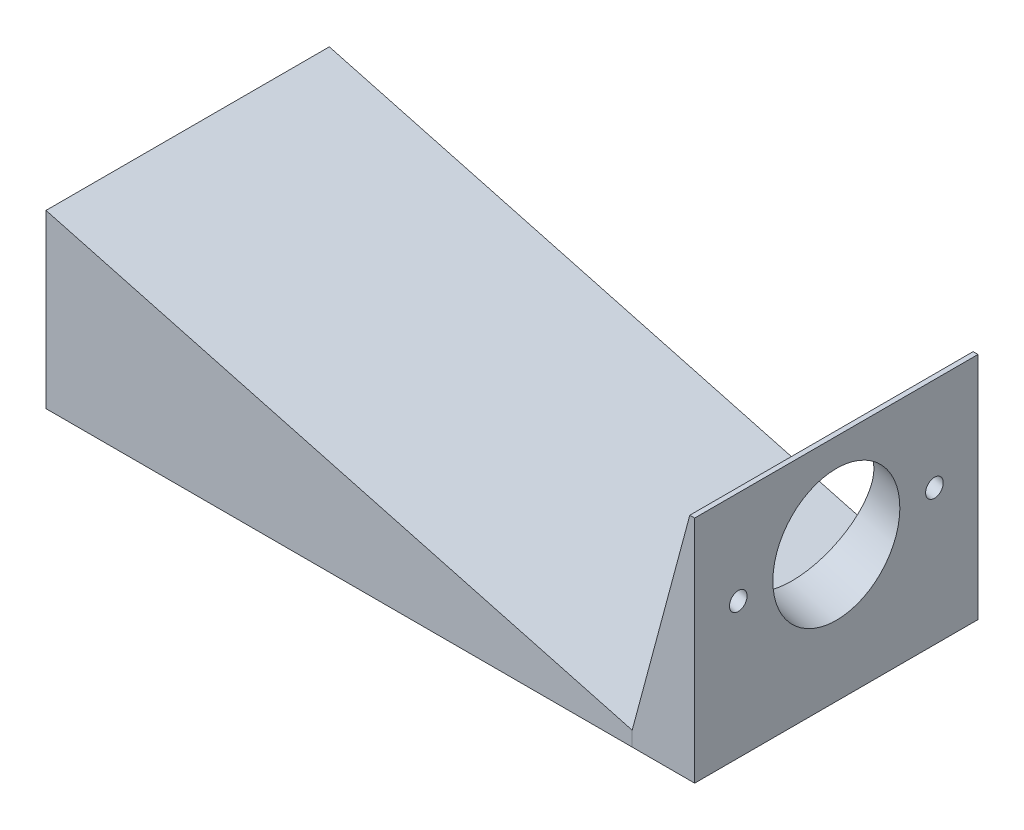
ISO-10303-21;
HEADER;
FILE_DESCRIPTION(('STEP AP214'),'2;1');
FILE_NAME('part.step','',(''),(''),'','','');
FILE_SCHEMA(('AUTOMOTIVE_DESIGN { 1 0 10303 214 1 1 1 1 }'));
ENDSEC;
DATA;
#1=APPLICATION_CONTEXT('core data for automotive mechanical design processes');
#2=APPLICATION_PROTOCOL_DEFINITION('international standard','automotive_design',2000,#1);
#3=PRODUCT_CONTEXT('',#1,'mechanical');
#4=PRODUCT('Part','Part','',(#3));
#5=PRODUCT_RELATED_PRODUCT_CATEGORY('part','',(#4));
#6=PRODUCT_DEFINITION_FORMATION('','',#4);
#7=PRODUCT_DEFINITION_CONTEXT('part definition',#1,'design');
#8=PRODUCT_DEFINITION('design','',#6,#7);
#9=PRODUCT_DEFINITION_SHAPE('','',#8);
#10=(LENGTH_UNIT() NAMED_UNIT(*) SI_UNIT(.MILLI.,.METRE.));
#11=(NAMED_UNIT(*) PLANE_ANGLE_UNIT() SI_UNIT($,.RADIAN.));
#12=(NAMED_UNIT(*) SI_UNIT($,.STERADIAN.) SOLID_ANGLE_UNIT());
#13=UNCERTAINTY_MEASURE_WITH_UNIT(LENGTH_MEASURE(1.E-05),#10,'distance_accuracy_value','');
#14=(GEOMETRIC_REPRESENTATION_CONTEXT(3) GLOBAL_UNCERTAINTY_ASSIGNED_CONTEXT((#13)) GLOBAL_UNIT_ASSIGNED_CONTEXT((#10,
#11,#12)) REPRESENTATION_CONTEXT('',''));
#15=CARTESIAN_POINT('',(0.,0.,0.));
#16=DIRECTION('',(0.,0.,1.));
#17=DIRECTION('',(1.,0.,0.));
#18=AXIS2_PLACEMENT_3D('',#15,#16,#17);
#19=CARTESIAN_POINT('',(36.3961711200607,0.,-29.));
#20=DIRECTION('',(0.,-1.,0.));
#21=DIRECTION('',(1.,0.,0.));
#22=AXIS2_PLACEMENT_3D('',#19,#20,#21);
#23=PLANE('',#22);
#24=DIRECTION('',(1.,0.,0.));
#25=VECTOR('',#24,1.);
#26=CARTESIAN_POINT('',(36.3961711200607,0.,0.));
#27=LINE('',#26,#25);
#28=CARTESIAN_POINT('',(30.,0.,0.));
#29=VERTEX_POINT('',#28);
#30=CARTESIAN_POINT('',(36.3961711200607,0.,0.));
#31=VERTEX_POINT('',#30);
#32=EDGE_CURVE('E127',#29,#31,#27,.T.);
#33=ORIENTED_EDGE('',*,*,#32,.F.);
#34=DIRECTION('',(0.,0.,1.));
#35=VECTOR('',#34,1.);
#36=CARTESIAN_POINT('',(30.,0.,-29.));
#37=LINE('',#36,#35);
#38=CARTESIAN_POINT('',(30.,0.,-29.));
#39=VERTEX_POINT('',#38);
#40=EDGE_CURVE('E12',#39,#29,#37,.T.);
#41=ORIENTED_EDGE('',*,*,#40,.F.);
#42=DIRECTION('',(1.,0.,0.));
#43=VECTOR('',#42,1.);
#44=CARTESIAN_POINT('',(36.3961711200607,0.,-29.));
#45=LINE('',#44,#43);
#46=CARTESIAN_POINT('',(36.3961711200607,0.,-29.));
#47=VERTEX_POINT('',#46);
#48=EDGE_CURVE('E122',#39,#47,#45,.T.);
#49=ORIENTED_EDGE('',*,*,#48,.T.);
#50=DIRECTION('',(0.,0.,1.));
#51=VECTOR('',#50,1.);
#52=CARTESIAN_POINT('',(36.3961711200607,0.,-29.));
#53=LINE('',#52,#51);
#54=EDGE_CURVE('E96',#47,#31,#53,.T.);
#55=ORIENTED_EDGE('',*,*,#54,.T.);
#56=EDGE_LOOP('',(#33,#41,#49,#55));
#57=FACE_BOUND('',#56,.T.);
#58=ADVANCED_FACE('F49',(#57),#23,.T.);
#59=CARTESIAN_POINT('',(30.,0.,-29.));
#60=DIRECTION('',(-1.,0.,0.));
#61=DIRECTION('',(0.,0.,1.));
#62=AXIS2_PLACEMENT_3D('',#59,#60,#61);
#63=PLANE('',#62);
#64=DIRECTION('',(0.,-1.,0.));
#65=VECTOR('',#64,1.);
#66=CARTESIAN_POINT('',(30.,0.,0.));
#67=LINE('',#66,#65);
#68=CARTESIAN_POINT('',(30.,1.50000000000001,0.));
#69=VERTEX_POINT('',#68);
#70=EDGE_CURVE('E137',#69,#29,#67,.T.);
#71=ORIENTED_EDGE('',*,*,#70,.F.);
#72=DIRECTION('',(0.,0.,1.));
#73=VECTOR('',#72,1.);
#74=CARTESIAN_POINT('',(30.,1.50000000000001,-29.));
#75=LINE('',#74,#73);
#76=CARTESIAN_POINT('',(30.,1.50000000000001,-29.));
#77=VERTEX_POINT('',#76);
#78=EDGE_CURVE('E58',#77,#69,#75,.T.);
#79=ORIENTED_EDGE('',*,*,#78,.F.);
#80=DIRECTION('',(0.,-1.,0.));
#81=VECTOR('',#80,1.);
#82=CARTESIAN_POINT('',(30.,0.,-29.));
#83=LINE('',#82,#81);
#84=EDGE_CURVE('E117',#77,#39,#83,.T.);
#85=ORIENTED_EDGE('',*,*,#84,.T.);
#86=ORIENTED_EDGE('',*,*,#40,.T.);
#87=EDGE_LOOP('',(#71,#79,#85,#86));
#88=FACE_BOUND('',#87,.T.);
#89=ADVANCED_FACE('F160',(#88),#63,.T.);
#90=CARTESIAN_POINT('',(30.,1.50000000000001,-29.));
#91=DIRECTION('',(-0.965925826289069,0.258819045102518,0.));
#92=DIRECTION('',(-0.258819045102518,-0.965925826289069,0.));
#93=AXIS2_PLACEMENT_3D('',#90,#91,#92);
#94=PLANE('',#93);
#95=CARTESIAN_POINT('',(33.5328799656494,14.6848875288458,-24.54));
#96=DIRECTION('',(-0.965925826289069,0.258819045102518,0.));
#97=DIRECTION('',(-0.258819045102518,-0.965925826289069,0.));
#98=AXIS2_PLACEMENT_3D('',#95,#96,#97);
#99=CIRCLE('',#98,0.900000000000001);
#100=CARTESIAN_POINT('',(33.2999428250571,13.8155542851856,-24.54));
#101=VERTEX_POINT('',#100);
#102=EDGE_CURVE('E147',#101,#101,#99,.T.);
#103=ORIENTED_EDGE('',*,*,#102,.F.);
#104=EDGE_LOOP('',(#103));
#105=FACE_BOUND('',#104,.T.);
#106=CARTESIAN_POINT('',(33.5328799656494,14.6848875288458,-4.46));
#107=DIRECTION('',(-0.965925826289069,0.258819045102518,0.));
#108=DIRECTION('',(0.258819045102518,0.965925826289069,0.));
#109=AXIS2_PLACEMENT_3D('',#106,#107,#108);
#110=CIRCLE('',#109,0.9);
#111=CARTESIAN_POINT('',(33.7658171062416,15.554220772506,-4.46));
#112=VERTEX_POINT('',#111);
#113=EDGE_CURVE('E152',#112,#112,#110,.T.);
#114=ORIENTED_EDGE('',*,*,#113,.F.);
#115=EDGE_LOOP('',(#114));
#116=FACE_BOUND('',#115,.T.);
#117=CARTESIAN_POINT('',(33.5328799656494,14.6848875288458,-14.5));
#118=DIRECTION('',(-0.965925826289069,0.258819045102518,0.));
#119=DIRECTION('',(-0.258819045102518,-0.965925826289069,0.));
#120=AXIS2_PLACEMENT_3D('',#117,#118,#119);
#121=CIRCLE('',#120,6.5);
#122=CARTESIAN_POINT('',(31.850556172483,8.40636965796685,-14.5));
#123=VERTEX_POINT('',#122);
#124=EDGE_CURVE('E144',#123,#123,#121,.T.);
#125=ORIENTED_EDGE('',*,*,#124,.F.);
#126=EDGE_LOOP('',(#125));
#127=FACE_BOUND('',#126,.T.);
#128=DIRECTION('',(-0.258819045102518,-0.965925826289069,0.));
#129=VECTOR('',#128,1.);
#130=CARTESIAN_POINT('',(30.,1.50000000000001,0.));
#131=LINE('',#130,#129);
#132=CARTESIAN_POINT('',(35.8961711200607,23.5048101901873,0.));
#133=VERTEX_POINT('',#132);
#134=EDGE_CURVE('E106',#133,#69,#131,.T.);
#135=ORIENTED_EDGE('',*,*,#134,.F.);
#136=DIRECTION('',(0.,0.,1.));
#137=VECTOR('',#136,1.);
#138=CARTESIAN_POINT('',(35.8961711200607,23.5048101901873,-29.));
#139=LINE('',#138,#137);
#140=CARTESIAN_POINT('',(35.8961711200607,23.5048101901873,-29.));
#141=VERTEX_POINT('',#140);
#142=EDGE_CURVE('E101',#141,#133,#139,.T.);
#143=ORIENTED_EDGE('',*,*,#142,.F.);
#144=DIRECTION('',(-0.258819045102518,-0.965925826289069,0.));
#145=VECTOR('',#144,1.);
#146=CARTESIAN_POINT('',(30.,1.50000000000001,-29.));
#147=LINE('',#146,#145);
#148=EDGE_CURVE('E104',#141,#77,#147,.T.);
#149=ORIENTED_EDGE('',*,*,#148,.T.);
#150=ORIENTED_EDGE('',*,*,#78,.T.);
#151=EDGE_LOOP('',(#135,#143,#149,#150));
#152=FACE_BOUND('',#151,.T.);
#153=ADVANCED_FACE('F103',(#105,#116,#127,#152),#94,.T.);
#154=CARTESIAN_POINT('',(35.8961711200607,23.5048101901873,-29.));
#155=DIRECTION('',(0.,1.,0.));
#156=DIRECTION('',(0.,0.,1.));
#157=AXIS2_PLACEMENT_3D('',#154,#155,#156);
#158=PLANE('',#157);
#159=DIRECTION('',(-1.,0.,0.));
#160=VECTOR('',#159,1.);
#161=CARTESIAN_POINT('',(35.8961711200607,23.5048101901873,0.));
#162=LINE('',#161,#160);
#163=CARTESIAN_POINT('',(36.3961711200607,23.5048101901873,0.));
#164=VERTEX_POINT('',#163);
#165=EDGE_CURVE('E134',#164,#133,#162,.T.);
#166=ORIENTED_EDGE('',*,*,#165,.F.);
#167=DIRECTION('',(0.,0.,1.));
#168=VECTOR('',#167,1.);
#169=CARTESIAN_POINT('',(36.3961711200607,23.5048101901873,-29.));
#170=LINE('',#169,#168);
#171=CARTESIAN_POINT('',(36.3961711200607,23.5048101901873,-29.));
#172=VERTEX_POINT('',#171);
#173=EDGE_CURVE('E111',#172,#164,#170,.T.);
#174=ORIENTED_EDGE('',*,*,#173,.F.);
#175=DIRECTION('',(-1.,0.,0.));
#176=VECTOR('',#175,1.);
#177=CARTESIAN_POINT('',(35.8961711200607,23.5048101901873,-29.));
#178=LINE('',#177,#176);
#179=EDGE_CURVE('E116',#172,#141,#178,.T.);
#180=ORIENTED_EDGE('',*,*,#179,.T.);
#181=ORIENTED_EDGE('',*,*,#142,.T.);
#182=EDGE_LOOP('',(#166,#174,#180,#181));
#183=FACE_BOUND('',#182,.T.);
#184=ADVANCED_FACE('F119',(#183),#158,.T.);
#185=CARTESIAN_POINT('',(36.3961711200607,23.5048101901873,-29.));
#186=DIRECTION('',(1.,0.,0.));
#187=DIRECTION('',(0.,0.,-1.));
#188=AXIS2_PLACEMENT_3D('',#185,#186,#187);
#189=PLANE('',#188);
#190=CARTESIAN_POINT('',(36.3961711200607,13.9176709763261,-24.54));
#191=DIRECTION('',(1.,0.,0.));
#192=DIRECTION('',(0.,1.,0.));
#193=AXIS2_PLACEMENT_3D('',#190,#191,#192);
#194=ELLIPSE('',#193,0.931748562369076,0.900000000000001);
#195=CARTESIAN_POINT('',(36.3961711200607,14.8494195386952,-24.54));
#196=VERTEX_POINT('',#195);
#197=EDGE_CURVE('E52',#196,#196,#194,.T.);
#198=ORIENTED_EDGE('',*,*,#197,.F.);
#199=EDGE_LOOP('',(#198));
#200=FACE_BOUND('',#199,.T.);
#201=CARTESIAN_POINT('',(36.3961711200607,13.9176709763261,-4.46));
#202=DIRECTION('',(1.,0.,0.));
#203=DIRECTION('',(0.,1.,0.));
#204=AXIS2_PLACEMENT_3D('',#201,#202,#203);
#205=ELLIPSE('',#204,0.931748562369074,0.9);
#206=CARTESIAN_POINT('',(36.3961711200607,14.8494195386952,-4.46));
#207=VERTEX_POINT('',#206);
#208=EDGE_CURVE('E145',#207,#207,#205,.T.);
#209=ORIENTED_EDGE('',*,*,#208,.F.);
#210=EDGE_LOOP('',(#209));
#211=FACE_BOUND('',#210,.T.);
#212=CARTESIAN_POINT('',(36.3961711200607,13.9176709763261,-14.5));
#213=DIRECTION('',(1.,0.,0.));
#214=DIRECTION('',(0.,1.,0.));
#215=AXIS2_PLACEMENT_3D('',#212,#213,#214);
#216=ELLIPSE('',#215,6.72929517266554,6.5);
#217=CARTESIAN_POINT('',(36.3961711200607,20.6469661489916,-14.5));
#218=VERTEX_POINT('',#217);
#219=EDGE_CURVE('E131',#218,#218,#216,.T.);
#220=ORIENTED_EDGE('',*,*,#219,.F.);
#221=EDGE_LOOP('',(#220));
#222=FACE_BOUND('',#221,.T.);
#223=DIRECTION('',(0.,1.,0.));
#224=VECTOR('',#223,1.);
#225=CARTESIAN_POINT('',(36.3961711200607,23.5048101901873,0.));
#226=LINE('',#225,#224);
#227=EDGE_CURVE('E130',#31,#164,#226,.T.);
#228=ORIENTED_EDGE('',*,*,#227,.F.);
#229=ORIENTED_EDGE('',*,*,#54,.F.);
#230=DIRECTION('',(0.,1.,0.));
#231=VECTOR('',#230,1.);
#232=CARTESIAN_POINT('',(36.3961711200607,23.5048101901873,-29.));
#233=LINE('',#232,#231);
#234=EDGE_CURVE('E120',#47,#172,#233,.T.);
#235=ORIENTED_EDGE('',*,*,#234,.T.);
#236=ORIENTED_EDGE('',*,*,#173,.T.);
#237=EDGE_LOOP('',(#228,#229,#235,#236));
#238=FACE_BOUND('',#237,.T.);
#239=ADVANCED_FACE('F163',(#200,#211,#222,#238),#189,.T.);
#240=CARTESIAN_POINT('',(0.,0.,-29.));
#241=DIRECTION('',(0.,0.,-1.));
#242=DIRECTION('',(-1.,0.,0.));
#243=AXIS2_PLACEMENT_3D('',#240,#241,#242);
#244=PLANE('',#243);
#245=ORIENTED_EDGE('',*,*,#48,.F.);
#246=ORIENTED_EDGE('',*,*,#84,.F.);
#247=ORIENTED_EDGE('',*,*,#148,.F.);
#248=ORIENTED_EDGE('',*,*,#179,.F.);
#249=ORIENTED_EDGE('',*,*,#234,.F.);
#250=EDGE_LOOP('',(#245,#246,#247,#248,#249));
#251=FACE_BOUND('',#250,.T.);
#252=ADVANCED_FACE('F115',(#251),#244,.T.);
#253=CARTESIAN_POINT('',(0.,0.,0.));
#254=DIRECTION('',(0.,0.,-1.));
#255=DIRECTION('',(-1.,0.,0.));
#256=AXIS2_PLACEMENT_3D('',#253,#254,#255);
#257=PLANE('',#256);
#258=ORIENTED_EDGE('',*,*,#32,.T.);
#259=ORIENTED_EDGE('',*,*,#227,.T.);
#260=ORIENTED_EDGE('',*,*,#165,.T.);
#261=ORIENTED_EDGE('',*,*,#134,.T.);
#262=ORIENTED_EDGE('',*,*,#70,.T.);
#263=EDGE_LOOP('',(#258,#259,#260,#261,#262));
#264=FACE_BOUND('',#263,.T.);
#265=ADVANCED_FACE('F162',(#264),#257,.F.);
#266=CARTESIAN_POINT('',(39.8755888641422,12.985363801669,-14.5));
#267=DIRECTION('',(-0.965925826289069,0.258819045102518,0.));
#268=DIRECTION('',(-0.258819045102518,-0.965925826289069,0.));
#269=AXIS2_PLACEMENT_3D('',#266,#267,#268);
#270=CYLINDRICAL_SURFACE('',#269,6.5);
#271=ORIENTED_EDGE('',*,*,#219,.T.);
#272=EDGE_LOOP('',(#271));
#273=FACE_BOUND('',#272,.T.);
#274=ORIENTED_EDGE('',*,*,#124,.T.);
#275=EDGE_LOOP('',(#274));
#276=FACE_BOUND('',#275,.T.);
#277=ADVANCED_FACE('F186',(#273,#276),#270,.F.);
#278=CARTESIAN_POINT('',(39.8755888641422,12.985363801669,-4.46));
#279=DIRECTION('',(-0.965925826289069,0.258819045102518,0.));
#280=DIRECTION('',(-0.258819045102518,-0.965925826289069,0.));
#281=AXIS2_PLACEMENT_3D('',#278,#279,#280);
#282=CYLINDRICAL_SURFACE('',#281,0.9);
#283=ORIENTED_EDGE('',*,*,#208,.T.);
#284=EDGE_LOOP('',(#283));
#285=FACE_BOUND('',#284,.T.);
#286=ORIENTED_EDGE('',*,*,#113,.T.);
#287=EDGE_LOOP('',(#286));
#288=FACE_BOUND('',#287,.T.);
#289=ADVANCED_FACE('F190',(#285,#288),#282,.F.);
#290=CARTESIAN_POINT('',(39.8755888641422,12.985363801669,-24.54));
#291=DIRECTION('',(-0.965925826289069,0.258819045102518,0.));
#292=DIRECTION('',(-0.258819045102518,-0.965925826289069,0.));
#293=AXIS2_PLACEMENT_3D('',#290,#291,#292);
#294=CYLINDRICAL_SURFACE('',#293,0.900000000000001);
#295=ORIENTED_EDGE('',*,*,#197,.T.);
#296=EDGE_LOOP('',(#295));
#297=FACE_BOUND('',#296,.T.);
#298=ORIENTED_EDGE('',*,*,#102,.T.);
#299=EDGE_LOOP('',(#298));
#300=FACE_BOUND('',#299,.T.);
#301=ADVANCED_FACE('F194',(#297,#300),#294,.F.);
#302=CLOSED_SHELL('',(#58,#89,#153,#184,#239,#252,#265,#277,#289,#301));
#303=MANIFOLD_SOLID_BREP('B2',#302);
#304=CARTESIAN_POINT('',(30.,1.50000000000001,-29.));
#305=DIRECTION('',(1.,0.,0.));
#306=DIRECTION('',(0.,0.,-1.));
#307=AXIS2_PLACEMENT_3D('',#304,#305,#306);
#308=PLANE('',#307);
#309=DIRECTION('',(0.,1.,0.));
#310=VECTOR('',#309,1.);
#311=CARTESIAN_POINT('',(30.,1.50000000000001,0.));
#312=LINE('',#311,#310);
#313=CARTESIAN_POINT('',(30.,0.,0.));
#314=VERTEX_POINT('',#313);
#315=CARTESIAN_POINT('',(30.,1.50000000000001,0.));
#316=VERTEX_POINT('',#315);
#317=EDGE_CURVE('E332',#314,#316,#312,.T.);
#318=ORIENTED_EDGE('',*,*,#317,.F.);
#319=DIRECTION('',(0.,0.,1.));
#320=VECTOR('',#319,1.);
#321=CARTESIAN_POINT('',(30.,0.,-29.));
#322=LINE('',#321,#320);
#323=CARTESIAN_POINT('',(30.,0.,-29.));
#324=VERTEX_POINT('',#323);
#325=EDGE_CURVE('E47',#324,#314,#322,.T.);
#326=ORIENTED_EDGE('',*,*,#325,.F.);
#327=DIRECTION('',(0.,1.,0.));
#328=VECTOR('',#327,1.);
#329=CARTESIAN_POINT('',(30.,1.50000000000001,-29.));
#330=LINE('',#329,#328);
#331=CARTESIAN_POINT('',(30.,1.50000000000001,-29.));
#332=VERTEX_POINT('',#331);
#333=EDGE_CURVE('E324',#324,#332,#330,.T.);
#334=ORIENTED_EDGE('',*,*,#333,.T.);
#335=DIRECTION('',(0.,0.,1.));
#336=VECTOR('',#335,1.);
#337=CARTESIAN_POINT('',(30.,1.50000000000001,-29.));
#338=LINE('',#337,#336);
#339=EDGE_CURVE('E265',#332,#316,#338,.T.);
#340=ORIENTED_EDGE('',*,*,#339,.T.);
#341=EDGE_LOOP('',(#318,#326,#334,#340));
#342=FACE_BOUND('',#341,.T.);
#343=ADVANCED_FACE('F262',(#342),#308,.T.);
#344=CARTESIAN_POINT('',(-30.,0.,-29.));
#345=DIRECTION('',(0.,-1.,0.));
#346=DIRECTION('',(1.,0.,0.));
#347=AXIS2_PLACEMENT_3D('',#344,#345,#346);
#348=PLANE('',#347);
#349=DIRECTION('',(1.,0.,0.));
#350=VECTOR('',#349,1.);
#351=CARTESIAN_POINT('',(-30.,0.,0.));
#352=LINE('',#351,#350);
#353=CARTESIAN_POINT('',(-30.,0.,0.));
#354=VERTEX_POINT('',#353);
#355=EDGE_CURVE('E327',#354,#314,#352,.T.);
#356=ORIENTED_EDGE('',*,*,#355,.F.);
#357=DIRECTION('',(0.,0.,1.));
#358=VECTOR('',#357,1.);
#359=CARTESIAN_POINT('',(-30.,0.,-29.));
#360=LINE('',#359,#358);
#361=CARTESIAN_POINT('',(-30.,0.,-29.));
#362=VERTEX_POINT('',#361);
#363=EDGE_CURVE('E272',#362,#354,#360,.T.);
#364=ORIENTED_EDGE('',*,*,#363,.F.);
#365=DIRECTION('',(1.,0.,0.));
#366=VECTOR('',#365,1.);
#367=CARTESIAN_POINT('',(-30.,0.,-29.));
#368=LINE('',#367,#366);
#369=EDGE_CURVE('E319',#362,#324,#368,.T.);
#370=ORIENTED_EDGE('',*,*,#369,.T.);
#371=ORIENTED_EDGE('',*,*,#325,.T.);
#372=EDGE_LOOP('',(#356,#364,#370,#371));
#373=FACE_BOUND('',#372,.T.);
#374=ADVANCED_FACE('F348',(#373),#348,.T.);
#375=CARTESIAN_POINT('',(-30.,0.,-29.));
#376=DIRECTION('',(-1.,0.,0.));
#377=DIRECTION('',(0.,0.,1.));
#378=AXIS2_PLACEMENT_3D('',#375,#376,#377);
#379=PLANE('',#378);
#380=DIRECTION('',(0.,-1.,0.));
#381=VECTOR('',#380,1.);
#382=CARTESIAN_POINT('',(-30.,0.,0.));
#383=LINE('',#382,#381);
#384=CARTESIAN_POINT('',(-30.,17.5769515458669,0.));
#385=VERTEX_POINT('',#384);
#386=EDGE_CURVE('E313',#385,#354,#383,.T.);
#387=ORIENTED_EDGE('',*,*,#386,.F.);
#388=DIRECTION('',(0.,0.,1.));
#389=VECTOR('',#388,1.);
#390=CARTESIAN_POINT('',(-30.,17.5769515458669,-29.));
#391=LINE('',#390,#389);
#392=CARTESIAN_POINT('',(-30.,17.5769515458669,-29.));
#393=VERTEX_POINT('',#392);
#394=EDGE_CURVE('E308',#393,#385,#391,.T.);
#395=ORIENTED_EDGE('',*,*,#394,.F.);
#396=DIRECTION('',(0.,-1.,0.));
#397=VECTOR('',#396,1.);
#398=CARTESIAN_POINT('',(-30.,0.,-29.));
#399=LINE('',#398,#397);
#400=EDGE_CURVE('E311',#393,#362,#399,.T.);
#401=ORIENTED_EDGE('',*,*,#400,.T.);
#402=ORIENTED_EDGE('',*,*,#363,.T.);
#403=EDGE_LOOP('',(#387,#395,#401,#402));
#404=FACE_BOUND('',#403,.T.);
#405=ADVANCED_FACE('F310',(#404),#379,.T.);
#406=CARTESIAN_POINT('',(-30.,17.5769515458669,-29.));
#407=DIRECTION('',(0.258819045102514,0.96592582628907,0.));
#408=DIRECTION('',(-0.96592582628907,0.258819045102514,0.));
#409=AXIS2_PLACEMENT_3D('',#406,#407,#408);
#410=PLANE('',#409);
#411=DIRECTION('',(-0.96592582628907,0.258819045102514,0.));
#412=VECTOR('',#411,1.);
#413=CARTESIAN_POINT('',(-30.,17.5769515458669,0.));
#414=LINE('',#413,#412);
#415=EDGE_CURVE('E336',#316,#385,#414,.T.);
#416=ORIENTED_EDGE('',*,*,#415,.F.);
#417=ORIENTED_EDGE('',*,*,#339,.F.);
#418=DIRECTION('',(-0.96592582628907,0.258819045102514,0.));
#419=VECTOR('',#418,1.);
#420=CARTESIAN_POINT('',(-30.,17.5769515458669,-29.));
#421=LINE('',#420,#419);
#422=EDGE_CURVE('E318',#332,#393,#421,.T.);
#423=ORIENTED_EDGE('',*,*,#422,.T.);
#424=ORIENTED_EDGE('',*,*,#394,.T.);
#425=EDGE_LOOP('',(#416,#417,#423,#424));
#426=FACE_BOUND('',#425,.T.);
#427=ADVANCED_FACE('F322',(#426),#410,.T.);
#428=CARTESIAN_POINT('',(0.,0.,-29.));
#429=DIRECTION('',(0.,0.,1.));
#430=DIRECTION('',(1.,0.,0.));
#431=AXIS2_PLACEMENT_3D('',#428,#429,#430);
#432=PLANE('',#431);
#433=ORIENTED_EDGE('',*,*,#333,.F.);
#434=ORIENTED_EDGE('',*,*,#369,.F.);
#435=ORIENTED_EDGE('',*,*,#400,.F.);
#436=ORIENTED_EDGE('',*,*,#422,.F.);
#437=EDGE_LOOP('',(#433,#434,#435,#436));
#438=FACE_BOUND('',#437,.T.);
#439=ADVANCED_FACE('F317',(#438),#432,.F.);
#440=CARTESIAN_POINT('',(0.,0.,0.));
#441=DIRECTION('',(0.,0.,1.));
#442=DIRECTION('',(1.,0.,0.));
#443=AXIS2_PLACEMENT_3D('',#440,#441,#442);
#444=PLANE('',#443);
#445=ORIENTED_EDGE('',*,*,#317,.T.);
#446=ORIENTED_EDGE('',*,*,#415,.T.);
#447=ORIENTED_EDGE('',*,*,#386,.T.);
#448=ORIENTED_EDGE('',*,*,#355,.T.);
#449=EDGE_LOOP('',(#445,#446,#447,#448));
#450=FACE_BOUND('',#449,.T.);
#451=ADVANCED_FACE('F347',(#450),#444,.T.);
#452=CLOSED_SHELL('',(#343,#374,#405,#427,#439,#451));
#453=MANIFOLD_SOLID_BREP('B6',#452);
#454=ADVANCED_BREP_SHAPE_REPRESENTATION('',(#18,#303,#453),#14);
#455=SHAPE_DEFINITION_REPRESENTATION(#9,#454);
ENDSEC;
END-ISO-10303-21;
